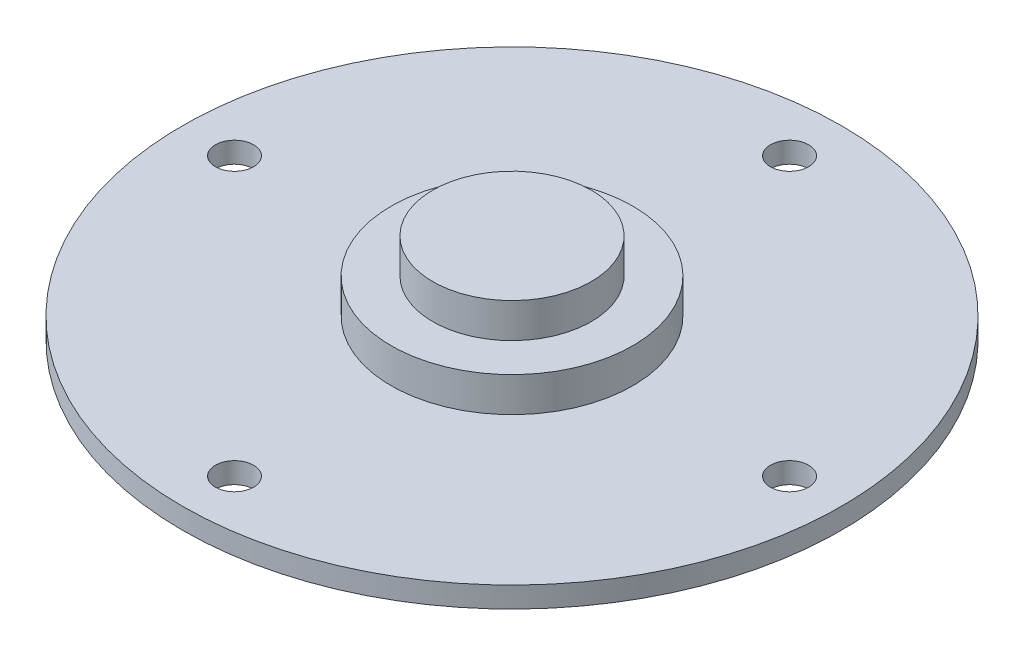
ISO-10303-21;
HEADER;
FILE_DESCRIPTION(('STEP AP214'),'2;1');
FILE_NAME('part.step','',(''),(''),'','','');
FILE_SCHEMA(('AUTOMOTIVE_DESIGN { 1 0 10303 214 1 1 1 1 }'));
ENDSEC;
DATA;
#1=APPLICATION_CONTEXT('core data for automotive mechanical design processes');
#2=APPLICATION_PROTOCOL_DEFINITION('international standard','automotive_design',2000,#1);
#3=PRODUCT_CONTEXT('',#1,'mechanical');
#4=PRODUCT('Part','Part','',(#3));
#5=PRODUCT_RELATED_PRODUCT_CATEGORY('part','',(#4));
#6=PRODUCT_DEFINITION_FORMATION('','',#4);
#7=PRODUCT_DEFINITION_CONTEXT('part definition',#1,'design');
#8=PRODUCT_DEFINITION('design','',#6,#7);
#9=PRODUCT_DEFINITION_SHAPE('','',#8);
#10=(LENGTH_UNIT() NAMED_UNIT(*) SI_UNIT(.MILLI.,.METRE.));
#11=(NAMED_UNIT(*) PLANE_ANGLE_UNIT() SI_UNIT($,.RADIAN.));
#12=(NAMED_UNIT(*) SI_UNIT($,.STERADIAN.) SOLID_ANGLE_UNIT());
#13=UNCERTAINTY_MEASURE_WITH_UNIT(LENGTH_MEASURE(1.E-05),#10,'distance_accuracy_value','');
#14=(GEOMETRIC_REPRESENTATION_CONTEXT(3) GLOBAL_UNCERTAINTY_ASSIGNED_CONTEXT((#13)) GLOBAL_UNIT_ASSIGNED_CONTEXT((#10,
#11,#12)) REPRESENTATION_CONTEXT('',''));
#15=CARTESIAN_POINT('',(0.,0.,0.));
#16=DIRECTION('',(0.,0.,1.));
#17=DIRECTION('',(1.,0.,0.));
#18=AXIS2_PLACEMENT_3D('',#15,#16,#17);
#19=CARTESIAN_POINT('',(0.,26.,0.));
#20=DIRECTION('',(0.,1.,0.));
#21=DIRECTION('',(0.,0.,1.));
#22=AXIS2_PLACEMENT_3D('',#19,#20,#21);
#23=PLANE('',#22);
#24=CARTESIAN_POINT('',(0.,26.,0.));
#25=DIRECTION('',(0.,-1.,0.));
#26=DIRECTION('',(0.,0.,-1.));
#27=AXIS2_PLACEMENT_3D('',#24,#25,#26);
#28=CIRCLE('',#27,22.85);
#29=CARTESIAN_POINT('',(0.,26.,-22.85));
#30=VERTEX_POINT('',#29);
#31=EDGE_CURVE('E10',#30,#30,#28,.T.);
#32=ORIENTED_EDGE('',*,*,#31,.F.);
#33=EDGE_LOOP('',(#32));
#34=FACE_BOUND('',#33,.T.);
#35=ADVANCED_FACE('F31',(#34),#23,.T.);
#36=CARTESIAN_POINT('',(0.,0.,0.));
#37=DIRECTION('',(0.,-1.,0.));
#38=DIRECTION('',(0.,0.,-1.));
#39=AXIS2_PLACEMENT_3D('',#36,#37,#38);
#40=CYLINDRICAL_SURFACE('',#39,22.85);
#41=ORIENTED_EDGE('',*,*,#31,.T.);
#42=EDGE_LOOP('',(#41));
#43=FACE_BOUND('',#42,.T.);
#44=CARTESIAN_POINT('',(0.,16.,0.));
#45=DIRECTION('',(0.,-1.,0.));
#46=DIRECTION('',(0.,0.,-1.));
#47=AXIS2_PLACEMENT_3D('',#44,#45,#46);
#48=CIRCLE('',#47,22.85);
#49=CARTESIAN_POINT('',(0.,16.,-22.85));
#50=VERTEX_POINT('',#49);
#51=EDGE_CURVE('E37',#50,#50,#48,.T.);
#52=ORIENTED_EDGE('',*,*,#51,.F.);
#53=EDGE_LOOP('',(#52));
#54=FACE_BOUND('',#53,.T.);
#55=ADVANCED_FACE('F117',(#43,#54),#40,.T.);
#56=CARTESIAN_POINT('',(0.,16.,-22.85));
#57=DIRECTION('',(0.,1.,0.));
#58=DIRECTION('',(0.,0.,1.));
#59=AXIS2_PLACEMENT_3D('',#56,#57,#58);
#60=PLANE('',#59);
#61=ORIENTED_EDGE('',*,*,#51,.T.);
#62=EDGE_LOOP('',(#61));
#63=FACE_BOUND('',#62,.T.);
#64=CARTESIAN_POINT('',(0.,16.,0.));
#65=DIRECTION('',(0.,-1.,0.));
#66=DIRECTION('',(0.,0.,-1.));
#67=AXIS2_PLACEMENT_3D('',#64,#65,#66);
#68=CIRCLE('',#67,34.85);
#69=CARTESIAN_POINT('',(0.,16.,-34.85));
#70=VERTEX_POINT('',#69);
#71=EDGE_CURVE('E41',#70,#70,#68,.T.);
#72=ORIENTED_EDGE('',*,*,#71,.F.);
#73=EDGE_LOOP('',(#72));
#74=FACE_BOUND('',#73,.T.);
#75=ADVANCED_FACE('F122',(#63,#74),#60,.T.);
#76=CARTESIAN_POINT('',(0.,0.,0.));
#77=DIRECTION('',(0.,-1.,0.));
#78=DIRECTION('',(0.,0.,-1.));
#79=AXIS2_PLACEMENT_3D('',#76,#77,#78);
#80=CYLINDRICAL_SURFACE('',#79,34.85);
#81=ORIENTED_EDGE('',*,*,#71,.T.);
#82=EDGE_LOOP('',(#81));
#83=FACE_BOUND('',#82,.T.);
#84=CARTESIAN_POINT('',(0.,6.,0.));
#85=DIRECTION('',(0.,-1.,0.));
#86=DIRECTION('',(0.,0.,-1.));
#87=AXIS2_PLACEMENT_3D('',#84,#85,#86);
#88=CIRCLE('',#87,34.85);
#89=CARTESIAN_POINT('',(0.,6.,-34.85));
#90=VERTEX_POINT('',#89);
#91=EDGE_CURVE('E45',#90,#90,#88,.T.);
#92=ORIENTED_EDGE('',*,*,#91,.F.);
#93=EDGE_LOOP('',(#92));
#94=FACE_BOUND('',#93,.T.);
#95=ADVANCED_FACE('F87',(#83,#94),#80,.T.);
#96=CARTESIAN_POINT('',(0.,6.,-34.85));
#97=DIRECTION('',(0.,1.,0.));
#98=DIRECTION('',(0.,0.,1.));
#99=AXIS2_PLACEMENT_3D('',#96,#97,#98);
#100=PLANE('',#99);
#101=CARTESIAN_POINT('',(80.,6.,-8.37952900688666E-13));
#102=DIRECTION('',(0.,1.,0.));
#103=DIRECTION('',(0.,0.,1.));
#104=AXIS2_PLACEMENT_3D('',#101,#102,#103);
#105=CIRCLE('',#104,5.50000000000001);
#106=CARTESIAN_POINT('',(80.,6.,5.49999999999917));
#107=VERTEX_POINT('',#106);
#108=EDGE_CURVE('E77',#107,#107,#105,.T.);
#109=ORIENTED_EDGE('',*,*,#108,.F.);
#110=EDGE_LOOP('',(#109));
#111=FACE_BOUND('',#110,.T.);
#112=CARTESIAN_POINT('',(0.,6.,80.));
#113=DIRECTION('',(0.,1.,0.));
#114=DIRECTION('',(0.,0.,1.));
#115=AXIS2_PLACEMENT_3D('',#112,#113,#114);
#116=CIRCLE('',#115,5.5);
#117=CARTESIAN_POINT('',(0.,6.,85.5));
#118=VERTEX_POINT('',#117);
#119=EDGE_CURVE('E71',#118,#118,#116,.T.);
#120=ORIENTED_EDGE('',*,*,#119,.F.);
#121=EDGE_LOOP('',(#120));
#122=FACE_BOUND('',#121,.T.);
#123=CARTESIAN_POINT('',(-80.,6.,2.79321127741136E-13));
#124=DIRECTION('',(0.,1.,0.));
#125=DIRECTION('',(0.,0.,1.));
#126=AXIS2_PLACEMENT_3D('',#123,#124,#125);
#127=CIRCLE('',#126,5.50000000000001);
#128=CARTESIAN_POINT('',(-80.,6.,5.50000000000028));
#129=VERTEX_POINT('',#128);
#130=EDGE_CURVE('E65',#129,#129,#127,.T.);
#131=ORIENTED_EDGE('',*,*,#130,.F.);
#132=EDGE_LOOP('',(#131));
#133=FACE_BOUND('',#132,.T.);
#134=CARTESIAN_POINT('',(0.,6.,-80.));
#135=DIRECTION('',(0.,1.,0.));
#136=DIRECTION('',(0.,0.,1.));
#137=AXIS2_PLACEMENT_3D('',#134,#135,#136);
#138=CIRCLE('',#137,5.5);
#139=CARTESIAN_POINT('',(0.,6.,-74.5));
#140=VERTEX_POINT('',#139);
#141=EDGE_CURVE('E59',#140,#140,#138,.T.);
#142=ORIENTED_EDGE('',*,*,#141,.F.);
#143=EDGE_LOOP('',(#142));
#144=FACE_BOUND('',#143,.T.);
#145=ORIENTED_EDGE('',*,*,#91,.T.);
#146=EDGE_LOOP('',(#145));
#147=FACE_BOUND('',#146,.T.);
#148=CARTESIAN_POINT('',(0.,6.,0.));
#149=DIRECTION('',(0.,-1.,0.));
#150=DIRECTION('',(0.,0.,-1.));
#151=AXIS2_PLACEMENT_3D('',#148,#149,#150);
#152=CIRCLE('',#151,95.);
#153=CARTESIAN_POINT('',(0.,6.,-95.));
#154=VERTEX_POINT('',#153);
#155=EDGE_CURVE('E50',#154,#154,#152,.T.);
#156=ORIENTED_EDGE('',*,*,#155,.F.);
#157=EDGE_LOOP('',(#156));
#158=FACE_BOUND('',#157,.T.);
#159=ADVANCED_FACE('F83',(#111,#122,#133,#144,#147,#158),#100,.T.);
#160=CARTESIAN_POINT('',(0.,0.,0.));
#161=DIRECTION('',(0.,-1.,0.));
#162=DIRECTION('',(0.,0.,-1.));
#163=AXIS2_PLACEMENT_3D('',#160,#161,#162);
#164=CYLINDRICAL_SURFACE('',#163,95.);
#165=ORIENTED_EDGE('',*,*,#155,.T.);
#166=EDGE_LOOP('',(#165));
#167=FACE_BOUND('',#166,.T.);
#168=CARTESIAN_POINT('',(0.,0.,0.));
#169=DIRECTION('',(0.,-1.,0.));
#170=DIRECTION('',(0.,0.,-1.));
#171=AXIS2_PLACEMENT_3D('',#168,#169,#170);
#172=CIRCLE('',#171,95.);
#173=CARTESIAN_POINT('',(0.,0.,-95.));
#174=VERTEX_POINT('',#173);
#175=EDGE_CURVE('E53',#174,#174,#172,.T.);
#176=ORIENTED_EDGE('',*,*,#175,.F.);
#177=EDGE_LOOP('',(#176));
#178=FACE_BOUND('',#177,.T.);
#179=ADVANCED_FACE('F86',(#167,#178),#164,.T.);
#180=CARTESIAN_POINT('',(0.,0.,0.));
#181=DIRECTION('',(0.,-1.,0.));
#182=DIRECTION('',(0.,0.,-1.));
#183=AXIS2_PLACEMENT_3D('',#180,#181,#182);
#184=PLANE('',#183);
#185=CARTESIAN_POINT('',(80.,0.,-8.37955521322352E-13));
#186=DIRECTION('',(0.,1.,0.));
#187=DIRECTION('',(0.,0.,1.));
#188=AXIS2_PLACEMENT_3D('',#185,#186,#187);
#189=CIRCLE('',#188,5.49999999999999);
#190=CARTESIAN_POINT('',(80.,0.,5.49999999999915));
#191=VERTEX_POINT('',#190);
#192=EDGE_CURVE('E74',#191,#191,#189,.T.);
#193=ORIENTED_EDGE('',*,*,#192,.T.);
#194=EDGE_LOOP('',(#193));
#195=FACE_BOUND('',#194,.T.);
#196=CARTESIAN_POINT('',(0.,0.,80.));
#197=DIRECTION('',(0.,1.,0.));
#198=DIRECTION('',(0.,0.,1.));
#199=AXIS2_PLACEMENT_3D('',#196,#197,#198);
#200=CIRCLE('',#199,5.5);
#201=CARTESIAN_POINT('',(0.,0.,85.5));
#202=VERTEX_POINT('',#201);
#203=EDGE_CURVE('E68',#202,#202,#200,.T.);
#204=ORIENTED_EDGE('',*,*,#203,.T.);
#205=EDGE_LOOP('',(#204));
#206=FACE_BOUND('',#205,.T.);
#207=CARTESIAN_POINT('',(-80.,0.,2.79318507107451E-13));
#208=DIRECTION('',(0.,1.,0.));
#209=DIRECTION('',(0.,0.,1.));
#210=AXIS2_PLACEMENT_3D('',#207,#208,#209);
#211=CIRCLE('',#210,5.49999999999999);
#212=CARTESIAN_POINT('',(-80.,0.,5.50000000000027));
#213=VERTEX_POINT('',#212);
#214=EDGE_CURVE('E62',#213,#213,#211,.T.);
#215=ORIENTED_EDGE('',*,*,#214,.T.);
#216=EDGE_LOOP('',(#215));
#217=FACE_BOUND('',#216,.T.);
#218=CARTESIAN_POINT('',(0.,0.,-80.));
#219=DIRECTION('',(0.,1.,0.));
#220=DIRECTION('',(0.,0.,1.));
#221=AXIS2_PLACEMENT_3D('',#218,#219,#220);
#222=CIRCLE('',#221,5.5);
#223=CARTESIAN_POINT('',(0.,0.,-74.5));
#224=VERTEX_POINT('',#223);
#225=EDGE_CURVE('E56',#224,#224,#222,.T.);
#226=ORIENTED_EDGE('',*,*,#225,.T.);
#227=EDGE_LOOP('',(#226));
#228=FACE_BOUND('',#227,.T.);
#229=ORIENTED_EDGE('',*,*,#175,.T.);
#230=EDGE_LOOP('',(#229));
#231=FACE_BOUND('',#230,.T.);
#232=ADVANCED_FACE('F101',(#195,#206,#217,#228,#231),#184,.T.);
#233=CARTESIAN_POINT('',(0.,6.,-80.));
#234=DIRECTION('',(0.,1.,0.));
#235=DIRECTION('',(0.,0.,1.));
#236=AXIS2_PLACEMENT_3D('',#233,#234,#235);
#237=CYLINDRICAL_SURFACE('',#236,5.5);
#238=ORIENTED_EDGE('',*,*,#225,.F.);
#239=EDGE_LOOP('',(#238));
#240=FACE_BOUND('',#239,.T.);
#241=ORIENTED_EDGE('',*,*,#141,.T.);
#242=EDGE_LOOP('',(#241));
#243=FACE_BOUND('',#242,.T.);
#244=ADVANCED_FACE('F106',(#240,#243),#237,.F.);
#245=CARTESIAN_POINT('',(-80.,6.,2.79321127741136E-13));
#246=DIRECTION('',(0.,1.,0.));
#247=DIRECTION('',(0.,0.,1.));
#248=AXIS2_PLACEMENT_3D('',#245,#246,#247);
#249=CYLINDRICAL_SURFACE('',#248,5.5);
#250=ORIENTED_EDGE('',*,*,#214,.F.);
#251=EDGE_LOOP('',(#250));
#252=FACE_BOUND('',#251,.T.);
#253=ORIENTED_EDGE('',*,*,#130,.T.);
#254=EDGE_LOOP('',(#253));
#255=FACE_BOUND('',#254,.T.);
#256=ADVANCED_FACE('F112',(#252,#255),#249,.F.);
#257=CARTESIAN_POINT('',(0.,6.,80.));
#258=DIRECTION('',(0.,1.,0.));
#259=DIRECTION('',(0.,0.,1.));
#260=AXIS2_PLACEMENT_3D('',#257,#258,#259);
#261=CYLINDRICAL_SURFACE('',#260,5.5);
#262=ORIENTED_EDGE('',*,*,#203,.F.);
#263=EDGE_LOOP('',(#262));
#264=FACE_BOUND('',#263,.T.);
#265=ORIENTED_EDGE('',*,*,#119,.T.);
#266=EDGE_LOOP('',(#265));
#267=FACE_BOUND('',#266,.T.);
#268=ADVANCED_FACE('F162',(#264,#267),#261,.F.);
#269=CARTESIAN_POINT('',(80.,6.,-8.37952900688666E-13));
#270=DIRECTION('',(0.,1.,0.));
#271=DIRECTION('',(0.,0.,1.));
#272=AXIS2_PLACEMENT_3D('',#269,#270,#271);
#273=CYLINDRICAL_SURFACE('',#272,5.5);
#274=ORIENTED_EDGE('',*,*,#192,.F.);
#275=EDGE_LOOP('',(#274));
#276=FACE_BOUND('',#275,.T.);
#277=ORIENTED_EDGE('',*,*,#108,.T.);
#278=EDGE_LOOP('',(#277));
#279=FACE_BOUND('',#278,.T.);
#280=ADVANCED_FACE('F81',(#276,#279),#273,.F.);
#281=CLOSED_SHELL('',(#35,#55,#75,#95,#159,#179,#232,#244,#256,#268,#280));
#282=MANIFOLD_SOLID_BREP('B2',#281);
#283=ADVANCED_BREP_SHAPE_REPRESENTATION('',(#18,#282),#14);
#284=SHAPE_DEFINITION_REPRESENTATION(#9,#283);
ENDSEC;
END-ISO-10303-21;
